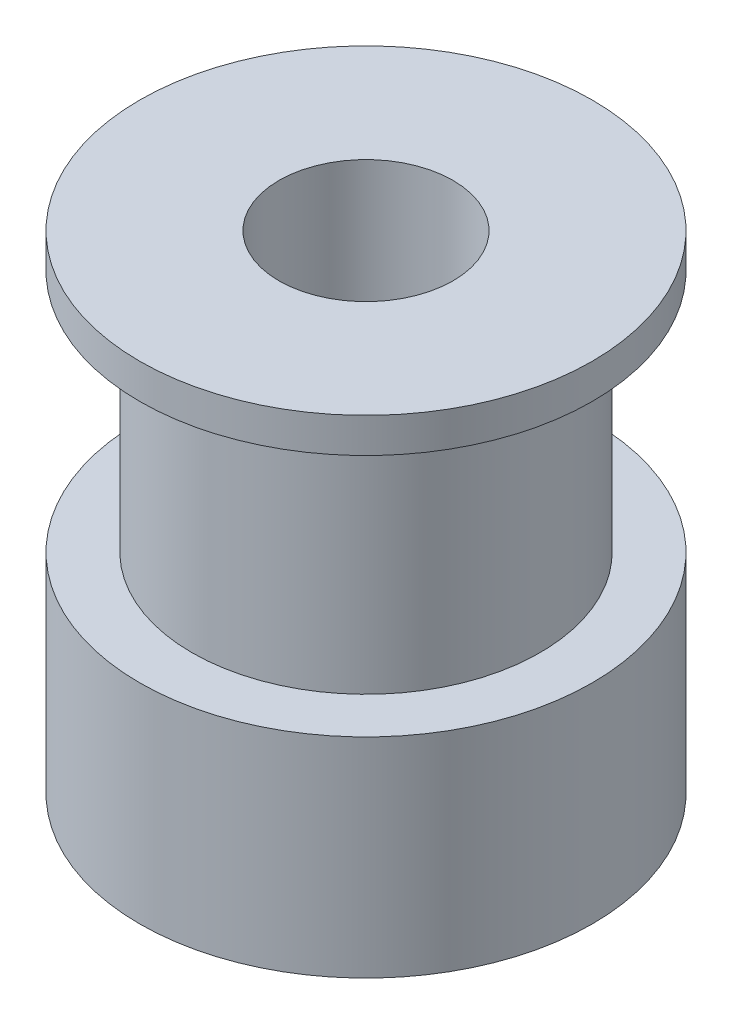
ISO-10303-21;
HEADER;
FILE_DESCRIPTION(('STEP AP214'),'2;1');
FILE_NAME('part.step','',(''),(''),'','','');
FILE_SCHEMA(('AUTOMOTIVE_DESIGN { 1 0 10303 214 1 1 1 1 }'));
ENDSEC;
DATA;
#1=APPLICATION_CONTEXT('core data for automotive mechanical design processes');
#2=APPLICATION_PROTOCOL_DEFINITION('international standard','automotive_design',2000,#1);
#3=PRODUCT_CONTEXT('',#1,'mechanical');
#4=PRODUCT('Part','Part','',(#3));
#5=PRODUCT_RELATED_PRODUCT_CATEGORY('part','',(#4));
#6=PRODUCT_DEFINITION_FORMATION('','',#4);
#7=PRODUCT_DEFINITION_CONTEXT('part definition',#1,'design');
#8=PRODUCT_DEFINITION('design','',#6,#7);
#9=PRODUCT_DEFINITION_SHAPE('','',#8);
#10=(LENGTH_UNIT() NAMED_UNIT(*) SI_UNIT(.MILLI.,.METRE.));
#11=(NAMED_UNIT(*) PLANE_ANGLE_UNIT() SI_UNIT($,.RADIAN.));
#12=(NAMED_UNIT(*) SI_UNIT($,.STERADIAN.) SOLID_ANGLE_UNIT());
#13=UNCERTAINTY_MEASURE_WITH_UNIT(LENGTH_MEASURE(1.E-05),#10,'distance_accuracy_value','');
#14=(GEOMETRIC_REPRESENTATION_CONTEXT(3) GLOBAL_UNCERTAINTY_ASSIGNED_CONTEXT((#13)) GLOBAL_UNIT_ASSIGNED_CONTEXT((#10,
#11,#12)) REPRESENTATION_CONTEXT('',''));
#15=CARTESIAN_POINT('',(0.,0.,0.));
#16=DIRECTION('',(0.,0.,1.));
#17=DIRECTION('',(1.,0.,0.));
#18=AXIS2_PLACEMENT_3D('',#15,#16,#17);
#19=CARTESIAN_POINT('',(0.,6.,0.));
#20=DIRECTION('',(0.,-1.,0.));
#21=DIRECTION('',(0.,0.,-1.));
#22=AXIS2_PLACEMENT_3D('',#19,#20,#21);
#23=CYLINDRICAL_SURFACE('',#22,6.5);
#24=CARTESIAN_POINT('',(0.,6.,0.));
#25=DIRECTION('',(0.,1.,0.));
#26=DIRECTION('',(0.,0.,1.));
#27=AXIS2_PLACEMENT_3D('',#24,#25,#26);
#28=CIRCLE('',#27,6.5);
#29=CARTESIAN_POINT('',(0.,6.,6.5));
#30=VERTEX_POINT('',#29);
#31=EDGE_CURVE('E49',#30,#30,#28,.T.);
#32=ORIENTED_EDGE('',*,*,#31,.F.);
#33=EDGE_LOOP('',(#32));
#34=FACE_BOUND('',#33,.T.);
#35=CARTESIAN_POINT('',(0.,0.,0.));
#36=DIRECTION('',(0.,1.,0.));
#37=DIRECTION('',(0.,0.,1.));
#38=AXIS2_PLACEMENT_3D('',#35,#36,#37);
#39=CIRCLE('',#38,6.5);
#40=CARTESIAN_POINT('',(0.,0.,6.5));
#41=VERTEX_POINT('',#40);
#42=EDGE_CURVE('E44',#41,#41,#39,.T.);
#43=ORIENTED_EDGE('',*,*,#42,.T.);
#44=EDGE_LOOP('',(#43));
#45=FACE_BOUND('',#44,.T.);
#46=ADVANCED_FACE('F41',(#34,#45),#23,.T.);
#47=CARTESIAN_POINT('',(0.,6.,0.));
#48=DIRECTION('',(0.,1.,0.));
#49=DIRECTION('',(0.,0.,1.));
#50=AXIS2_PLACEMENT_3D('',#47,#48,#49);
#51=PLANE('',#50);
#52=CARTESIAN_POINT('',(0.,6.,0.));
#53=DIRECTION('',(0.,1.,0.));
#54=DIRECTION('',(0.,0.,1.));
#55=AXIS2_PLACEMENT_3D('',#52,#53,#54);
#56=CIRCLE('',#55,5.);
#57=CARTESIAN_POINT('',(0.,6.,5.));
#58=VERTEX_POINT('',#57);
#59=EDGE_CURVE('E10',#58,#58,#56,.T.);
#60=ORIENTED_EDGE('',*,*,#59,.F.);
#61=EDGE_LOOP('',(#60));
#62=FACE_BOUND('',#61,.T.);
#63=ORIENTED_EDGE('',*,*,#31,.T.);
#64=EDGE_LOOP('',(#63));
#65=FACE_BOUND('',#64,.T.);
#66=ADVANCED_FACE('F102',(#62,#65),#51,.T.);
#67=CARTESIAN_POINT('',(0.,0.,0.));
#68=DIRECTION('',(0.,1.,0.));
#69=DIRECTION('',(0.,0.,1.));
#70=AXIS2_PLACEMENT_3D('',#67,#68,#69);
#71=PLANE('',#70);
#72=CARTESIAN_POINT('',(0.,0.,0.));
#73=DIRECTION('',(0.,1.,0.));
#74=DIRECTION('',(0.,0.,1.));
#75=AXIS2_PLACEMENT_3D('',#72,#73,#74);
#76=CIRCLE('',#75,2.5);
#77=CARTESIAN_POINT('',(0.,0.,2.5));
#78=VERTEX_POINT('',#77);
#79=EDGE_CURVE('E65',#78,#78,#76,.T.);
#80=ORIENTED_EDGE('',*,*,#79,.T.);
#81=EDGE_LOOP('',(#80));
#82=FACE_BOUND('',#81,.T.);
#83=ORIENTED_EDGE('',*,*,#42,.F.);
#84=EDGE_LOOP('',(#83));
#85=FACE_BOUND('',#84,.T.);
#86=ADVANCED_FACE('F107',(#82,#85),#71,.F.);
#87=CARTESIAN_POINT('',(0.,13.,0.));
#88=DIRECTION('',(0.,-1.,0.));
#89=DIRECTION('',(0.,0.,-1.));
#90=AXIS2_PLACEMENT_3D('',#87,#88,#89);
#91=CYLINDRICAL_SURFACE('',#90,5.);
#92=CARTESIAN_POINT('',(0.,13.,0.));
#93=DIRECTION('',(0.,1.,0.));
#94=DIRECTION('',(0.,0.,1.));
#95=AXIS2_PLACEMENT_3D('',#92,#93,#94);
#96=CIRCLE('',#95,5.);
#97=CARTESIAN_POINT('',(0.,13.,5.));
#98=VERTEX_POINT('',#97);
#99=EDGE_CURVE('E56',#98,#98,#96,.T.);
#100=ORIENTED_EDGE('',*,*,#99,.F.);
#101=EDGE_LOOP('',(#100));
#102=FACE_BOUND('',#101,.T.);
#103=ORIENTED_EDGE('',*,*,#59,.T.);
#104=EDGE_LOOP('',(#103));
#105=FACE_BOUND('',#104,.T.);
#106=ADVANCED_FACE('F90',(#102,#105),#91,.T.);
#107=CARTESIAN_POINT('',(0.,14.,0.));
#108=DIRECTION('',(0.,-1.,0.));
#109=DIRECTION('',(0.,0.,-1.));
#110=AXIS2_PLACEMENT_3D('',#107,#108,#109);
#111=CYLINDRICAL_SURFACE('',#110,6.5);
#112=CARTESIAN_POINT('',(0.,14.,0.));
#113=DIRECTION('',(0.,1.,0.));
#114=DIRECTION('',(0.,0.,1.));
#115=AXIS2_PLACEMENT_3D('',#112,#113,#114);
#116=CIRCLE('',#115,6.5);
#117=CARTESIAN_POINT('',(0.,14.,6.5));
#118=VERTEX_POINT('',#117);
#119=EDGE_CURVE('E60',#118,#118,#116,.T.);
#120=ORIENTED_EDGE('',*,*,#119,.F.);
#121=EDGE_LOOP('',(#120));
#122=FACE_BOUND('',#121,.T.);
#123=CARTESIAN_POINT('',(0.,13.,0.));
#124=DIRECTION('',(0.,1.,0.));
#125=DIRECTION('',(0.,0.,1.));
#126=AXIS2_PLACEMENT_3D('',#123,#124,#125);
#127=CIRCLE('',#126,6.5);
#128=CARTESIAN_POINT('',(0.,13.,6.5));
#129=VERTEX_POINT('',#128);
#130=EDGE_CURVE('E61',#129,#129,#127,.T.);
#131=ORIENTED_EDGE('',*,*,#130,.T.);
#132=EDGE_LOOP('',(#131));
#133=FACE_BOUND('',#132,.T.);
#134=ADVANCED_FACE('F84',(#122,#133),#111,.T.);
#135=CARTESIAN_POINT('',(0.,14.,0.));
#136=DIRECTION('',(0.,1.,0.));
#137=DIRECTION('',(0.,0.,1.));
#138=AXIS2_PLACEMENT_3D('',#135,#136,#137);
#139=PLANE('',#138);
#140=CARTESIAN_POINT('',(0.,14.,0.));
#141=DIRECTION('',(0.,1.,0.));
#142=DIRECTION('',(0.,0.,1.));
#143=AXIS2_PLACEMENT_3D('',#140,#141,#142);
#144=CIRCLE('',#143,2.5);
#145=CARTESIAN_POINT('',(0.,14.,2.5));
#146=VERTEX_POINT('',#145);
#147=EDGE_CURVE('E72',#146,#146,#144,.T.);
#148=ORIENTED_EDGE('',*,*,#147,.F.);
#149=EDGE_LOOP('',(#148));
#150=FACE_BOUND('',#149,.T.);
#151=ORIENTED_EDGE('',*,*,#119,.T.);
#152=EDGE_LOOP('',(#151));
#153=FACE_BOUND('',#152,.T.);
#154=ADVANCED_FACE('F80',(#150,#153),#139,.T.);
#155=CARTESIAN_POINT('',(0.,13.,0.));
#156=DIRECTION('',(0.,1.,0.));
#157=DIRECTION('',(0.,0.,1.));
#158=AXIS2_PLACEMENT_3D('',#155,#156,#157);
#159=PLANE('',#158);
#160=ORIENTED_EDGE('',*,*,#99,.T.);
#161=EDGE_LOOP('',(#160));
#162=FACE_BOUND('',#161,.T.);
#163=ORIENTED_EDGE('',*,*,#130,.F.);
#164=EDGE_LOOP('',(#163));
#165=FACE_BOUND('',#164,.T.);
#166=ADVANCED_FACE('F83',(#162,#165),#159,.F.);
#167=CARTESIAN_POINT('',(0.,-16.,0.));
#168=DIRECTION('',(0.,1.,0.));
#169=DIRECTION('',(0.,0.,1.));
#170=AXIS2_PLACEMENT_3D('',#167,#168,#169);
#171=CYLINDRICAL_SURFACE('',#170,2.5);
#172=ORIENTED_EDGE('',*,*,#147,.T.);
#173=EDGE_LOOP('',(#172));
#174=FACE_BOUND('',#173,.T.);
#175=ORIENTED_EDGE('',*,*,#79,.F.);
#176=EDGE_LOOP('',(#175));
#177=FACE_BOUND('',#176,.T.);
#178=ADVANCED_FACE('F77',(#174,#177),#171,.F.);
#179=CLOSED_SHELL('',(#46,#66,#86,#106,#134,#154,#166,#178));
#180=MANIFOLD_SOLID_BREP('B2',#179);
#181=ADVANCED_BREP_SHAPE_REPRESENTATION('',(#18,#180),#14);
#182=SHAPE_DEFINITION_REPRESENTATION(#9,#181);
ENDSEC;
END-ISO-10303-21;
